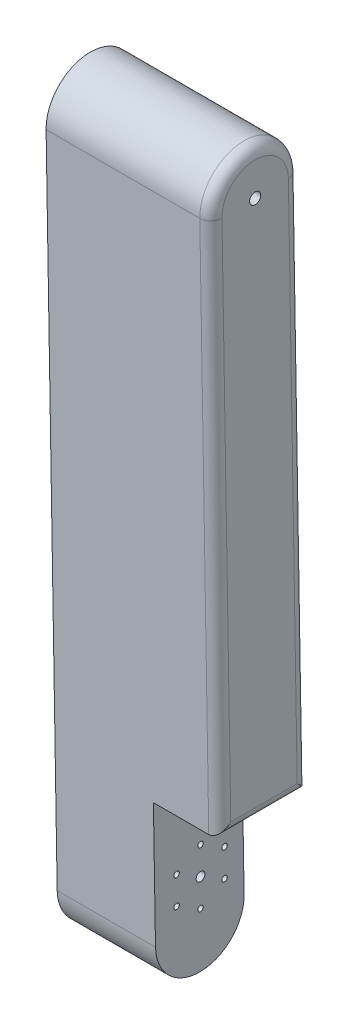
ISO-10303-21;
HEADER;
FILE_DESCRIPTION(('STEP AP214'),'2;1');
FILE_NAME('part.step','',(''),(''),'','','');
FILE_SCHEMA(('AUTOMOTIVE_DESIGN { 1 0 10303 214 1 1 1 1 }'));
ENDSEC;
DATA;
#1=APPLICATION_CONTEXT('core data for automotive mechanical design processes');
#2=APPLICATION_PROTOCOL_DEFINITION('international standard','automotive_design',2000,#1);
#3=PRODUCT_CONTEXT('',#1,'mechanical');
#4=PRODUCT('Part','Part','',(#3));
#5=PRODUCT_RELATED_PRODUCT_CATEGORY('part','',(#4));
#6=PRODUCT_DEFINITION_FORMATION('','',#4);
#7=PRODUCT_DEFINITION_CONTEXT('part definition',#1,'design');
#8=PRODUCT_DEFINITION('design','',#6,#7);
#9=PRODUCT_DEFINITION_SHAPE('','',#8);
#10=(LENGTH_UNIT() NAMED_UNIT(*) SI_UNIT(.MILLI.,.METRE.));
#11=(NAMED_UNIT(*) PLANE_ANGLE_UNIT() SI_UNIT($,.RADIAN.));
#12=(NAMED_UNIT(*) SI_UNIT($,.STERADIAN.) SOLID_ANGLE_UNIT());
#13=UNCERTAINTY_MEASURE_WITH_UNIT(LENGTH_MEASURE(1.E-05),#10,'distance_accuracy_value','');
#14=(GEOMETRIC_REPRESENTATION_CONTEXT(3) GLOBAL_UNCERTAINTY_ASSIGNED_CONTEXT((#13)) GLOBAL_UNIT_ASSIGNED_CONTEXT((#10,
#11,#12)) REPRESENTATION_CONTEXT('',''));
#15=CARTESIAN_POINT('',(0.,0.,0.));
#16=DIRECTION('',(0.,0.,1.));
#17=DIRECTION('',(1.,0.,0.));
#18=AXIS2_PLACEMENT_3D('',#15,#16,#17);
#19=CARTESIAN_POINT('',(74.4,-300.,-5.));
#20=DIRECTION('',(-1.,0.,0.));
#21=DIRECTION('',(0.,0.,1.));
#22=AXIS2_PLACEMENT_3D('',#19,#20,#21);
#23=CYLINDRICAL_SURFACE('',#22,20.);
#24=CARTESIAN_POINT('',(44.4,-300.,-5.));
#25=DIRECTION('',(1.,0.,0.));
#26=DIRECTION('',(0.,0.,-1.));
#27=AXIS2_PLACEMENT_3D('',#24,#25,#26);
#28=CIRCLE('',#27,20.);
#29=CARTESIAN_POINT('',(44.4,-300.33328704668,14.997222800792));
#30=VERTEX_POINT('',#29);
#31=CARTESIAN_POINT('',(44.4,-299.66671295332,-24.997222800792));
#32=VERTEX_POINT('',#31);
#33=EDGE_CURVE('E114',#30,#32,#28,.T.);
#34=ORIENTED_EDGE('',*,*,#33,.F.);
#35=DIRECTION('',(-1.,0.,0.));
#36=VECTOR('',#35,1.);
#37=CARTESIAN_POINT('',(74.4,-300.33328704668,14.997222800792));
#38=LINE('',#37,#36);
#39=CARTESIAN_POINT('',(0.,-300.33328704668,14.997222800792));
#40=VERTEX_POINT('',#39);
#41=EDGE_CURVE('E141',#30,#40,#38,.T.);
#42=ORIENTED_EDGE('',*,*,#41,.T.);
#43=CARTESIAN_POINT('',(0.,-300.,-5.));
#44=DIRECTION('',(1.,0.,0.));
#45=DIRECTION('',(0.,0.,-1.));
#46=AXIS2_PLACEMENT_3D('',#43,#44,#45);
#47=CIRCLE('',#46,20.);
#48=CARTESIAN_POINT('',(0.,-299.66671295332,-24.997222800792));
#49=VERTEX_POINT('',#48);
#50=EDGE_CURVE('E138',#40,#49,#47,.T.);
#51=ORIENTED_EDGE('',*,*,#50,.T.);
#52=DIRECTION('',(-1.,0.,0.));
#53=VECTOR('',#52,1.);
#54=CARTESIAN_POINT('',(74.4,-299.66671295332,-24.997222800792));
#55=LINE('',#54,#53);
#56=EDGE_CURVE('E130',#32,#49,#55,.T.);
#57=ORIENTED_EDGE('',*,*,#56,.F.);
#58=EDGE_LOOP('',(#34,#42,#51,#57));
#59=FACE_BOUND('',#58,.T.);
#60=ADVANCED_FACE('F47',(#59),#23,.T.);
#61=CARTESIAN_POINT('',(74.4,0.,0.));
#62=DIRECTION('',(-1.,0.,0.));
#63=DIRECTION('',(0.,0.,1.));
#64=AXIS2_PLACEMENT_3D('',#61,#62,#63);
#65=CYLINDRICAL_SURFACE('',#64,20.);
#66=DIRECTION('',(-1.,0.,0.));
#67=VECTOR('',#66,1.);
#68=CARTESIAN_POINT('',(74.4,-0.333287046679867,19.997222800792));
#69=LINE('',#68,#67);
#70=CARTESIAN_POINT('',(69.4,-0.333287046679867,19.997222800792));
#71=VERTEX_POINT('',#70);
#72=CARTESIAN_POINT('',(0.,-0.333287046679867,19.997222800792));
#73=VERTEX_POINT('',#72);
#74=EDGE_CURVE('E146',#71,#73,#69,.T.);
#75=ORIENTED_EDGE('',*,*,#74,.F.);
#76=CARTESIAN_POINT('',(69.4,0.,0.));
#77=DIRECTION('',(1.,0.,0.));
#78=DIRECTION('',(0.,0.,-1.));
#79=AXIS2_PLACEMENT_3D('',#76,#77,#78);
#80=CIRCLE('',#79,20.);
#81=CARTESIAN_POINT('',(69.4,0.333287046679867,-19.997222800792));
#82=VERTEX_POINT('',#81);
#83=EDGE_CURVE('E72',#71,#82,#80,.F.);
#84=ORIENTED_EDGE('',*,*,#83,.T.);
#85=DIRECTION('',(-1.,0.,0.));
#86=VECTOR('',#85,1.);
#87=CARTESIAN_POINT('',(74.4,0.333287046679867,-19.997222800792));
#88=LINE('',#87,#86);
#89=CARTESIAN_POINT('',(0.,0.333287046679867,-19.997222800792));
#90=VERTEX_POINT('',#89);
#91=EDGE_CURVE('E142',#82,#90,#88,.T.);
#92=ORIENTED_EDGE('',*,*,#91,.T.);
#93=CARTESIAN_POINT('',(0.,0.,0.));
#94=DIRECTION('',(1.,0.,0.));
#95=DIRECTION('',(0.,0.,-1.));
#96=AXIS2_PLACEMENT_3D('',#93,#94,#95);
#97=CIRCLE('',#96,20.);
#98=EDGE_CURVE('E239',#90,#73,#97,.T.);
#99=ORIENTED_EDGE('',*,*,#98,.T.);
#100=EDGE_LOOP('',(#75,#84,#92,#99));
#101=FACE_BOUND('',#100,.T.);
#102=ADVANCED_FACE('F253',(#101),#65,.T.);
#103=CARTESIAN_POINT('',(74.4,-0.333287046679867,19.997222800792));
#104=DIRECTION('',(0.,0.0166643523339933,-0.9998611400396));
#105=DIRECTION('',(0.,0.9998611400396,0.0166643523339933));
#106=AXIS2_PLACEMENT_3D('',#103,#104,#105);
#107=PLANE('',#106);
#108=DIRECTION('',(1.,0.,0.));
#109=VECTOR('',#108,1.);
#110=CARTESIAN_POINT('',(44.4,-243.317443397269,15.9474868616155));
#111=LINE('',#110,#109);
#112=CARTESIAN_POINT('',(44.4,-243.317443397269,15.9474868616155));
#113=VERTEX_POINT('',#112);
#114=CARTESIAN_POINT('',(69.4,-243.317443397269,15.9474868616155));
#115=VERTEX_POINT('',#114);
#116=EDGE_CURVE('E126',#113,#115,#111,.T.);
#117=ORIENTED_EDGE('',*,*,#116,.T.);
#118=DIRECTION('',(0.,-0.9998611400396,-0.0166643523339933));
#119=VECTOR('',#118,1.);
#120=CARTESIAN_POINT('',(69.4,-0.333287046679867,19.997222800792));
#121=LINE('',#120,#119);
#122=EDGE_CURVE('E167',#115,#71,#121,.F.);
#123=ORIENTED_EDGE('',*,*,#122,.T.);
#124=ORIENTED_EDGE('',*,*,#74,.T.);
#125=DIRECTION('',(0.,-0.9998611400396,-0.0166643523339933));
#126=VECTOR('',#125,1.);
#127=CARTESIAN_POINT('',(0.,-0.333287046679867,19.997222800792));
#128=LINE('',#127,#126);
#129=EDGE_CURVE('E243',#73,#40,#128,.T.);
#130=ORIENTED_EDGE('',*,*,#129,.T.);
#131=ORIENTED_EDGE('',*,*,#41,.F.);
#132=DIRECTION('',(0.,-0.9998611400396,-0.0166643523339933));
#133=VECTOR('',#132,1.);
#134=CARTESIAN_POINT('',(44.4,-0.333287046679867,19.997222800792));
#135=LINE('',#134,#133);
#136=EDGE_CURVE('E121',#113,#30,#135,.T.);
#137=ORIENTED_EDGE('',*,*,#136,.F.);
#138=EDGE_LOOP('',(#117,#123,#124,#130,#131,#137));
#139=FACE_BOUND('',#138,.T.);
#140=ADVANCED_FACE('F255',(#139),#107,.F.);
#141=CARTESIAN_POINT('',(74.4,0.333287046679867,-19.997222800792));
#142=DIRECTION('',(0.,-0.0166643523339933,0.9998611400396));
#143=DIRECTION('',(0.,-0.9998611400396,-0.0166643523339933));
#144=AXIS2_PLACEMENT_3D('',#141,#142,#143);
#145=PLANE('',#144);
#146=ORIENTED_EDGE('',*,*,#91,.F.);
#147=DIRECTION('',(0.,0.9998611400396,0.0166643523339933));
#148=VECTOR('',#147,1.);
#149=CARTESIAN_POINT('',(69.4,-243.317443397269,-24.0580683081911));
#150=LINE('',#149,#148);
#151=CARTESIAN_POINT('',(69.4,-243.317443397269,-24.0580683081911));
#152=VERTEX_POINT('',#151);
#153=EDGE_CURVE('E57',#82,#152,#150,.F.);
#154=ORIENTED_EDGE('',*,*,#153,.T.);
#155=DIRECTION('',(1.,0.,0.));
#156=VECTOR('',#155,1.);
#157=CARTESIAN_POINT('',(44.4,-243.317443397269,-24.0580683081911));
#158=LINE('',#157,#156);
#159=CARTESIAN_POINT('',(44.4,-243.317443397269,-24.0580683081911));
#160=VERTEX_POINT('',#159);
#161=EDGE_CURVE('E132',#160,#152,#158,.T.);
#162=ORIENTED_EDGE('',*,*,#161,.F.);
#163=DIRECTION('',(0.,0.9998611400396,0.0166643523339933));
#164=VECTOR('',#163,1.);
#165=CARTESIAN_POINT('',(44.4,-243.317443397269,-24.0580683081911));
#166=LINE('',#165,#164);
#167=EDGE_CURVE('E118',#32,#160,#166,.T.);
#168=ORIENTED_EDGE('',*,*,#167,.F.);
#169=ORIENTED_EDGE('',*,*,#56,.T.);
#170=DIRECTION('',(0.,0.9998611400396,0.0166643523339933));
#171=VECTOR('',#170,1.);
#172=CARTESIAN_POINT('',(0.,0.333287046679867,-19.997222800792));
#173=LINE('',#172,#171);
#174=EDGE_CURVE('E148',#49,#90,#173,.T.);
#175=ORIENTED_EDGE('',*,*,#174,.T.);
#176=EDGE_LOOP('',(#146,#154,#162,#168,#169,#175));
#177=FACE_BOUND('',#176,.T.);
#178=ADVANCED_FACE('F128',(#177),#145,.F.);
#179=CARTESIAN_POINT('',(74.4,0.,0.));
#180=DIRECTION('',(1.,0.,0.));
#181=DIRECTION('',(0.,0.,-1.));
#182=AXIS2_PLACEMENT_3D('',#179,#180,#181);
#183=PLANE('',#182);
#184=CARTESIAN_POINT('',(74.4,0.,0.));
#185=DIRECTION('',(1.,0.,0.));
#186=DIRECTION('',(0.,0.,-1.));
#187=AXIS2_PLACEMENT_3D('',#184,#185,#186);
#188=CIRCLE('',#187,2.5);
#189=CARTESIAN_POINT('',(74.4,0.,2.5));
#190=VERTEX_POINT('',#189);
#191=EDGE_CURVE('E456',#190,#190,#188,.T.);
#192=ORIENTED_EDGE('',*,*,#191,.F.);
#193=EDGE_LOOP('',(#192));
#194=FACE_BOUND('',#193,.T.);
#195=CARTESIAN_POINT('',(74.4,0.,0.));
#196=DIRECTION('',(1.,0.,0.));
#197=DIRECTION('',(0.,0.,-1.));
#198=AXIS2_PLACEMENT_3D('',#195,#196,#197);
#199=CIRCLE('',#198,15.);
#200=CARTESIAN_POINT('',(74.4,0.2499652850099,-14.997917100594));
#201=VERTEX_POINT('',#200);
#202=CARTESIAN_POINT('',(74.4,-0.2499652850099,14.997917100594));
#203=VERTEX_POINT('',#202);
#204=EDGE_CURVE('E160',#201,#203,#199,.T.);
#205=ORIENTED_EDGE('',*,*,#204,.T.);
#206=DIRECTION('',(0.,-0.9998611400396,-0.0166643523339933));
#207=VECTOR('',#206,1.);
#208=CARTESIAN_POINT('',(74.4,-243.234121635599,10.9481811614175));
#209=LINE('',#208,#207);
#210=CARTESIAN_POINT('',(74.4,-238.317443397269,11.030125798723));
#211=VERTEX_POINT('',#210);
#212=EDGE_CURVE('E163',#203,#211,#209,.T.);
#213=ORIENTED_EDGE('',*,*,#212,.T.);
#214=DIRECTION('',(0.,0.,1.));
#215=VECTOR('',#214,1.);
#216=CARTESIAN_POINT('',(74.4,-238.317443397269,-24.0580683081911));
#217=LINE('',#216,#215);
#218=CARTESIAN_POINT('',(74.4,-238.317443397269,-18.974040578632));
#219=VERTEX_POINT('',#218);
#220=EDGE_CURVE('E154',#211,#219,#217,.F.);
#221=ORIENTED_EDGE('',*,*,#220,.T.);
#222=DIRECTION('',(0.,0.9998611400396,0.0166643523339933));
#223=VECTOR('',#222,1.);
#224=CARTESIAN_POINT('',(74.4,0.2499652850099,-14.997917100594));
#225=LINE('',#224,#223);
#226=EDGE_CURVE('E157',#219,#201,#225,.T.);
#227=ORIENTED_EDGE('',*,*,#226,.T.);
#228=EDGE_LOOP('',(#205,#213,#221,#227));
#229=FACE_BOUND('',#228,.T.);
#230=ADVANCED_FACE('F269',(#194,#229),#183,.T.);
#231=CARTESIAN_POINT('',(0.,0.,0.));
#232=DIRECTION('',(1.,0.,0.));
#233=DIRECTION('',(0.,0.,-1.));
#234=AXIS2_PLACEMENT_3D('',#231,#232,#233);
#235=PLANE('',#234);
#236=CARTESIAN_POINT('',(0.,0.,0.));
#237=DIRECTION('',(-1.,0.,0.));
#238=DIRECTION('',(0.,0.,1.));
#239=AXIS2_PLACEMENT_3D('',#236,#237,#238);
#240=CIRCLE('',#239,2.5);
#241=CARTESIAN_POINT('',(0.,0.,2.5));
#242=VERTEX_POINT('',#241);
#243=EDGE_CURVE('E459',#242,#242,#240,.T.);
#244=ORIENTED_EDGE('',*,*,#243,.F.);
#245=EDGE_LOOP('',(#244));
#246=FACE_BOUND('',#245,.T.);
#247=CARTESIAN_POINT('',(0.,-282.858832161411,-5.33328704608928));
#248=DIRECTION('',(1.,0.,0.));
#249=DIRECTION('',(0.,0.,-1.));
#250=AXIS2_PLACEMENT_3D('',#247,#248,#249);
#251=CIRCLE('',#250,2.);
#252=CARTESIAN_POINT('',(0.,-282.858832161411,-7.33328704608928));
#253=VERTEX_POINT('',#252);
#254=EDGE_CURVE('E194',#253,#253,#251,.T.);
#255=ORIENTED_EDGE('',*,*,#254,.T.);
#256=EDGE_LOOP('',(#255));
#257=FACE_BOUND('',#256,.T.);
#258=CARTESIAN_POINT('',(0.,-270.358832161411,-5.33328704608928));
#259=DIRECTION('',(1.,0.,0.));
#260=DIRECTION('',(0.,0.,-1.));
#261=AXIS2_PLACEMENT_3D('',#258,#259,#260);
#262=CIRCLE('',#261,1.25);
#263=CARTESIAN_POINT('',(0.,-270.358832161411,-6.58328704608928));
#264=VERTEX_POINT('',#263);
#265=EDGE_CURVE('E179',#264,#264,#262,.T.);
#266=ORIENTED_EDGE('',*,*,#265,.T.);
#267=EDGE_LOOP('',(#266));
#268=FACE_BOUND('',#267,.T.);
#269=CARTESIAN_POINT('',(0.,-276.608832161411,-16.1586045933947));
#270=DIRECTION('',(1.,0.,0.));
#271=DIRECTION('',(0.,0.,-1.));
#272=AXIS2_PLACEMENT_3D('',#269,#270,#271);
#273=CIRCLE('',#272,1.24999999999998);
#274=CARTESIAN_POINT('',(0.,-276.608832161411,-17.4086045933947));
#275=VERTEX_POINT('',#274);
#276=EDGE_CURVE('E213',#275,#275,#273,.T.);
#277=ORIENTED_EDGE('',*,*,#276,.T.);
#278=EDGE_LOOP('',(#277));
#279=FACE_BOUND('',#278,.T.);
#280=CARTESIAN_POINT('',(0.,-289.108832161411,-16.1586045933947));
#281=DIRECTION('',(1.,0.,0.));
#282=DIRECTION('',(0.,0.,-1.));
#283=AXIS2_PLACEMENT_3D('',#280,#281,#282);
#284=CIRCLE('',#283,1.24999999999998);
#285=CARTESIAN_POINT('',(0.,-289.108832161411,-17.4086045933947));
#286=VERTEX_POINT('',#285);
#287=EDGE_CURVE('E209',#286,#286,#284,.T.);
#288=ORIENTED_EDGE('',*,*,#287,.T.);
#289=EDGE_LOOP('',(#288));
#290=FACE_BOUND('',#289,.T.);
#291=CARTESIAN_POINT('',(0.,-295.358832161411,-5.33328704608928));
#292=DIRECTION('',(1.,0.,0.));
#293=DIRECTION('',(0.,0.,-1.));
#294=AXIS2_PLACEMENT_3D('',#291,#292,#293);
#295=CIRCLE('',#294,1.25);
#296=CARTESIAN_POINT('',(0.,-295.358832161411,-6.58328704608927));
#297=VERTEX_POINT('',#296);
#298=EDGE_CURVE('E204',#297,#297,#295,.T.);
#299=ORIENTED_EDGE('',*,*,#298,.T.);
#300=EDGE_LOOP('',(#299));
#301=FACE_BOUND('',#300,.T.);
#302=CARTESIAN_POINT('',(0.,-289.108832161411,5.49203050121622));
#303=DIRECTION('',(1.,0.,0.));
#304=DIRECTION('',(0.,0.,-1.));
#305=AXIS2_PLACEMENT_3D('',#302,#303,#304);
#306=CIRCLE('',#305,1.24999999999998);
#307=CARTESIAN_POINT('',(0.,-289.108832161411,4.24203050121623));
#308=VERTEX_POINT('',#307);
#309=EDGE_CURVE('E199',#308,#308,#306,.T.);
#310=ORIENTED_EDGE('',*,*,#309,.T.);
#311=EDGE_LOOP('',(#310));
#312=FACE_BOUND('',#311,.T.);
#313=CARTESIAN_POINT('',(0.,-276.608832161411,5.49203050121624));
#314=DIRECTION('',(1.,0.,0.));
#315=DIRECTION('',(0.,0.,-1.));
#316=AXIS2_PLACEMENT_3D('',#313,#314,#315);
#317=CIRCLE('',#316,1.25000000000003);
#318=CARTESIAN_POINT('',(0.,-276.608832161411,4.24203050121621));
#319=VERTEX_POINT('',#318);
#320=EDGE_CURVE('E193',#319,#319,#317,.T.);
#321=ORIENTED_EDGE('',*,*,#320,.T.);
#322=EDGE_LOOP('',(#321));
#323=FACE_BOUND('',#322,.T.);
#324=ORIENTED_EDGE('',*,*,#98,.F.);
#325=ORIENTED_EDGE('',*,*,#174,.F.);
#326=ORIENTED_EDGE('',*,*,#50,.F.);
#327=ORIENTED_EDGE('',*,*,#129,.F.);
#328=EDGE_LOOP('',(#324,#325,#326,#327));
#329=FACE_BOUND('',#328,.T.);
#330=ADVANCED_FACE('F252',(#246,#257,#268,#279,#290,#301,#312,#323,#329),#235,.F.);
#331=CARTESIAN_POINT('',(44.4,-300.007916719122,-4.52499685265799));
#332=DIRECTION('',(1.,0.,0.));
#333=DIRECTION('',(0.,0.,-1.));
#334=AXIS2_PLACEMENT_3D('',#331,#332,#333);
#335=PLANE('',#334);
#336=CARTESIAN_POINT('',(44.4,-282.858832161411,-5.33328704608928));
#337=DIRECTION('',(1.,0.,0.));
#338=DIRECTION('',(0.,0.,-1.));
#339=AXIS2_PLACEMENT_3D('',#336,#337,#338);
#340=CIRCLE('',#339,2.);
#341=CARTESIAN_POINT('',(44.4,-282.858832161411,-7.33328704608928));
#342=VERTEX_POINT('',#341);
#343=EDGE_CURVE('E51',#342,#342,#340,.T.);
#344=ORIENTED_EDGE('',*,*,#343,.F.);
#345=EDGE_LOOP('',(#344));
#346=FACE_BOUND('',#345,.T.);
#347=CARTESIAN_POINT('',(44.4,-270.358832161411,-5.33328704608928));
#348=DIRECTION('',(1.,0.,0.));
#349=DIRECTION('',(0.,0.,-1.));
#350=AXIS2_PLACEMENT_3D('',#347,#348,#349);
#351=CIRCLE('',#350,1.25);
#352=CARTESIAN_POINT('',(44.4,-270.358832161411,-6.58328704608928));
#353=VERTEX_POINT('',#352);
#354=EDGE_CURVE('E214',#353,#353,#351,.T.);
#355=ORIENTED_EDGE('',*,*,#354,.F.);
#356=EDGE_LOOP('',(#355));
#357=FACE_BOUND('',#356,.T.);
#358=CARTESIAN_POINT('',(44.4,-276.608832161411,-16.1586045933947));
#359=DIRECTION('',(1.,0.,0.));
#360=DIRECTION('',(0.,0.,-1.));
#361=AXIS2_PLACEMENT_3D('',#358,#359,#360);
#362=CIRCLE('',#361,1.24999999999998);
#363=CARTESIAN_POINT('',(44.4,-276.608832161411,-17.4086045933947));
#364=VERTEX_POINT('',#363);
#365=EDGE_CURVE('E210',#364,#364,#362,.T.);
#366=ORIENTED_EDGE('',*,*,#365,.F.);
#367=EDGE_LOOP('',(#366));
#368=FACE_BOUND('',#367,.T.);
#369=CARTESIAN_POINT('',(44.4,-289.108832161411,-16.1586045933947));
#370=DIRECTION('',(1.,0.,0.));
#371=DIRECTION('',(0.,0.,-1.));
#372=AXIS2_PLACEMENT_3D('',#369,#370,#371);
#373=CIRCLE('',#372,1.24999999999998);
#374=CARTESIAN_POINT('',(44.4,-289.108832161411,-17.4086045933947));
#375=VERTEX_POINT('',#374);
#376=EDGE_CURVE('E205',#375,#375,#373,.T.);
#377=ORIENTED_EDGE('',*,*,#376,.F.);
#378=EDGE_LOOP('',(#377));
#379=FACE_BOUND('',#378,.T.);
#380=CARTESIAN_POINT('',(44.4,-295.358832161411,-5.33328704608928));
#381=DIRECTION('',(1.,0.,0.));
#382=DIRECTION('',(0.,0.,-1.));
#383=AXIS2_PLACEMENT_3D('',#380,#381,#382);
#384=CIRCLE('',#383,1.25);
#385=CARTESIAN_POINT('',(44.4,-295.358832161411,-6.58328704608927));
#386=VERTEX_POINT('',#385);
#387=EDGE_CURVE('E200',#386,#386,#384,.T.);
#388=ORIENTED_EDGE('',*,*,#387,.F.);
#389=EDGE_LOOP('',(#388));
#390=FACE_BOUND('',#389,.T.);
#391=CARTESIAN_POINT('',(44.4,-289.108832161411,5.49203050121622));
#392=DIRECTION('',(1.,0.,0.));
#393=DIRECTION('',(0.,0.,-1.));
#394=AXIS2_PLACEMENT_3D('',#391,#392,#393);
#395=CIRCLE('',#394,1.24999999999998);
#396=CARTESIAN_POINT('',(44.4,-289.108832161411,4.24203050121623));
#397=VERTEX_POINT('',#396);
#398=EDGE_CURVE('E195',#397,#397,#395,.T.);
#399=ORIENTED_EDGE('',*,*,#398,.F.);
#400=EDGE_LOOP('',(#399));
#401=FACE_BOUND('',#400,.T.);
#402=CARTESIAN_POINT('',(44.4,-276.608832161411,5.49203050121624));
#403=DIRECTION('',(1.,0.,0.));
#404=DIRECTION('',(0.,0.,-1.));
#405=AXIS2_PLACEMENT_3D('',#402,#403,#404);
#406=CIRCLE('',#405,1.25000000000003);
#407=CARTESIAN_POINT('',(44.4,-276.608832161411,4.24203050121621));
#408=VERTEX_POINT('',#407);
#409=EDGE_CURVE('E189',#408,#408,#406,.T.);
#410=ORIENTED_EDGE('',*,*,#409,.F.);
#411=EDGE_LOOP('',(#410));
#412=FACE_BOUND('',#411,.T.);
#413=ORIENTED_EDGE('',*,*,#136,.T.);
#414=ORIENTED_EDGE('',*,*,#33,.T.);
#415=ORIENTED_EDGE('',*,*,#167,.T.);
#416=DIRECTION('',(0.,0.,1.));
#417=VECTOR('',#416,1.);
#418=CARTESIAN_POINT('',(44.4,-243.317443397269,15.9474868616155));
#419=LINE('',#418,#417);
#420=EDGE_CURVE('E134',#160,#113,#419,.T.);
#421=ORIENTED_EDGE('',*,*,#420,.T.);
#422=EDGE_LOOP('',(#413,#414,#415,#421));
#423=FACE_BOUND('',#422,.T.);
#424=ADVANCED_FACE('F116',(#346,#357,#368,#379,#390,#401,#412,#423),#335,.T.);
#425=CARTESIAN_POINT('',(44.4,-243.317443397269,15.9474868616155));
#426=DIRECTION('',(0.,1.,0.));
#427=DIRECTION('',(0.,0.,1.));
#428=AXIS2_PLACEMENT_3D('',#425,#426,#427);
#429=PLANE('',#428);
#430=ORIENTED_EDGE('',*,*,#161,.T.);
#431=DIRECTION('',(0.,0.,1.));
#432=VECTOR('',#431,1.);
#433=CARTESIAN_POINT('',(69.4,-243.317443397269,15.9474868616155));
#434=LINE('',#433,#432);
#435=EDGE_CURVE('E11',#152,#115,#434,.T.);
#436=ORIENTED_EDGE('',*,*,#435,.T.);
#437=ORIENTED_EDGE('',*,*,#116,.F.);
#438=ORIENTED_EDGE('',*,*,#420,.F.);
#439=EDGE_LOOP('',(#430,#436,#437,#438));
#440=FACE_BOUND('',#439,.T.);
#441=ADVANCED_FACE('F276',(#440),#429,.F.);
#442=CARTESIAN_POINT('',(69.4,0.2499652850099,-14.997917100594));
#443=DIRECTION('',(0.,-0.9998611400396,-0.0166643523339933));
#444=DIRECTION('',(0.,0.0166643523339933,-0.9998611400396));
#445=AXIS2_PLACEMENT_3D('',#442,#443,#444);
#446=CYLINDRICAL_SURFACE('',#445,5.);
#447=CARTESIAN_POINT('',(69.4,-238.317443397269,-18.974040578632));
#448=DIRECTION('',(0.,0.712974176367557,-0.701190290743535));
#449=DIRECTION('',(0.,-0.701190290743535,-0.712974176367557));
#450=AXIS2_PLACEMENT_3D('',#447,#448,#449);
#451=ELLIPSE('',#450,7.13073193682995,5.);
#452=EDGE_CURVE('E182',#152,#219,#451,.F.);
#453=ORIENTED_EDGE('',*,*,#452,.F.);
#454=ORIENTED_EDGE('',*,*,#153,.F.);
#455=CARTESIAN_POINT('',(69.4,0.2499652850099,-14.997917100594));
#456=DIRECTION('',(0.,0.9998611400396,0.0166643523339933));
#457=DIRECTION('',(0.,-0.0166643523339933,0.9998611400396));
#458=AXIS2_PLACEMENT_3D('',#455,#456,#457);
#459=CIRCLE('',#458,5.);
#460=EDGE_CURVE('E135',#201,#82,#459,.T.);
#461=ORIENTED_EDGE('',*,*,#460,.F.);
#462=ORIENTED_EDGE('',*,*,#226,.F.);
#463=EDGE_LOOP('',(#453,#454,#461,#462));
#464=FACE_BOUND('',#463,.T.);
#465=ADVANCED_FACE('F49',(#464),#446,.T.);
#466=CARTESIAN_POINT('',(69.4,0.,0.));
#467=DIRECTION('',(1.,0.,0.));
#468=DIRECTION('',(0.,0.,-1.));
#469=AXIS2_PLACEMENT_3D('',#466,#467,#468);
#470=TOROIDAL_SURFACE('',#469,15.,5.);
#471=ORIENTED_EDGE('',*,*,#460,.T.);
#472=ORIENTED_EDGE('',*,*,#83,.F.);
#473=CARTESIAN_POINT('',(69.4,-0.2499652850099,14.997917100594));
#474=DIRECTION('',(0.,-0.9998611400396,-0.0166643523339933));
#475=DIRECTION('',(0.,0.0166643523339933,-0.9998611400396));
#476=AXIS2_PLACEMENT_3D('',#473,#474,#475);
#477=CIRCLE('',#476,5.);
#478=EDGE_CURVE('E178',#203,#71,#477,.T.);
#479=ORIENTED_EDGE('',*,*,#478,.F.);
#480=ORIENTED_EDGE('',*,*,#204,.F.);
#481=EDGE_LOOP('',(#471,#472,#479,#480));
#482=FACE_BOUND('',#481,.T.);
#483=ADVANCED_FACE('F273',(#482),#470,.T.);
#484=CARTESIAN_POINT('',(69.4,-238.317443397269,15.9474868616155));
#485=DIRECTION('',(0.,0.,-1.));
#486=DIRECTION('',(-1.,0.,0.));
#487=AXIS2_PLACEMENT_3D('',#484,#485,#486);
#488=CYLINDRICAL_SURFACE('',#487,5.);
#489=ORIENTED_EDGE('',*,*,#452,.T.);
#490=ORIENTED_EDGE('',*,*,#220,.F.);
#491=CARTESIAN_POINT('',(69.4,-238.317443397269,11.030125798723));
#492=DIRECTION('',(0.,-0.701190290743535,-0.712974176367557));
#493=DIRECTION('',(0.,0.712974176367557,-0.701190290743535));
#494=AXIS2_PLACEMENT_3D('',#491,#492,#493);
#495=ELLIPSE('',#494,7.01287671521832,5.);
#496=EDGE_CURVE('E175',#115,#211,#495,.F.);
#497=ORIENTED_EDGE('',*,*,#496,.F.);
#498=ORIENTED_EDGE('',*,*,#435,.F.);
#499=EDGE_LOOP('',(#489,#490,#497,#498));
#500=FACE_BOUND('',#499,.T.);
#501=ADVANCED_FACE('F265',(#500),#488,.T.);
#502=CARTESIAN_POINT('',(69.4,-0.2499652850099,14.997917100594));
#503=DIRECTION('',(0.,0.9998611400396,0.0166643523339933));
#504=DIRECTION('',(0.,-0.0166643523339933,0.9998611400396));
#505=AXIS2_PLACEMENT_3D('',#502,#503,#504);
#506=CYLINDRICAL_SURFACE('',#505,5.);
#507=ORIENTED_EDGE('',*,*,#478,.T.);
#508=ORIENTED_EDGE('',*,*,#122,.F.);
#509=ORIENTED_EDGE('',*,*,#496,.T.);
#510=ORIENTED_EDGE('',*,*,#212,.F.);
#511=EDGE_LOOP('',(#507,#508,#509,#510));
#512=FACE_BOUND('',#511,.T.);
#513=ADVANCED_FACE('F259',(#512),#506,.T.);
#514=CARTESIAN_POINT('',(74.4,-276.608832161411,5.49203050121624));
#515=DIRECTION('',(-1.,0.,0.));
#516=DIRECTION('',(0.,0.,1.));
#517=AXIS2_PLACEMENT_3D('',#514,#515,#516);
#518=CYLINDRICAL_SURFACE('',#517,1.25000000000003);
#519=ORIENTED_EDGE('',*,*,#409,.T.);
#520=EDGE_LOOP('',(#519));
#521=FACE_BOUND('',#520,.T.);
#522=ORIENTED_EDGE('',*,*,#320,.F.);
#523=EDGE_LOOP('',(#522));
#524=FACE_BOUND('',#523,.T.);
#525=ADVANCED_FACE('F296',(#521,#524),#518,.F.);
#526=CARTESIAN_POINT('',(74.4,-289.108832161411,5.49203050121622));
#527=DIRECTION('',(-1.,0.,0.));
#528=DIRECTION('',(0.,0.,1.));
#529=AXIS2_PLACEMENT_3D('',#526,#527,#528);
#530=CYLINDRICAL_SURFACE('',#529,1.24999999999998);
#531=ORIENTED_EDGE('',*,*,#398,.T.);
#532=EDGE_LOOP('',(#531));
#533=FACE_BOUND('',#532,.T.);
#534=ORIENTED_EDGE('',*,*,#309,.F.);
#535=EDGE_LOOP('',(#534));
#536=FACE_BOUND('',#535,.T.);
#537=ADVANCED_FACE('F314',(#533,#536),#530,.F.);
#538=CARTESIAN_POINT('',(74.4,-295.358832161411,-5.33328704608928));
#539=DIRECTION('',(-1.,0.,0.));
#540=DIRECTION('',(0.,0.,1.));
#541=AXIS2_PLACEMENT_3D('',#538,#539,#540);
#542=CYLINDRICAL_SURFACE('',#541,1.25);
#543=ORIENTED_EDGE('',*,*,#387,.T.);
#544=EDGE_LOOP('',(#543));
#545=FACE_BOUND('',#544,.T.);
#546=ORIENTED_EDGE('',*,*,#298,.F.);
#547=EDGE_LOOP('',(#546));
#548=FACE_BOUND('',#547,.T.);
#549=ADVANCED_FACE('F323',(#545,#548),#542,.F.);
#550=CARTESIAN_POINT('',(74.4,-289.108832161411,-16.1586045933947));
#551=DIRECTION('',(-1.,0.,0.));
#552=DIRECTION('',(0.,0.,1.));
#553=AXIS2_PLACEMENT_3D('',#550,#551,#552);
#554=CYLINDRICAL_SURFACE('',#553,1.24999999999998);
#555=ORIENTED_EDGE('',*,*,#376,.T.);
#556=EDGE_LOOP('',(#555));
#557=FACE_BOUND('',#556,.T.);
#558=ORIENTED_EDGE('',*,*,#287,.F.);
#559=EDGE_LOOP('',(#558));
#560=FACE_BOUND('',#559,.T.);
#561=ADVANCED_FACE('F332',(#557,#560),#554,.F.);
#562=CARTESIAN_POINT('',(74.4,-276.608832161411,-16.1586045933947));
#563=DIRECTION('',(-1.,0.,0.));
#564=DIRECTION('',(0.,0.,1.));
#565=AXIS2_PLACEMENT_3D('',#562,#563,#564);
#566=CYLINDRICAL_SURFACE('',#565,1.24999999999998);
#567=ORIENTED_EDGE('',*,*,#365,.T.);
#568=EDGE_LOOP('',(#567));
#569=FACE_BOUND('',#568,.T.);
#570=ORIENTED_EDGE('',*,*,#276,.F.);
#571=EDGE_LOOP('',(#570));
#572=FACE_BOUND('',#571,.T.);
#573=ADVANCED_FACE('F341',(#569,#572),#566,.F.);
#574=CARTESIAN_POINT('',(74.4,-270.358832161411,-5.33328704608928));
#575=DIRECTION('',(-1.,0.,0.));
#576=DIRECTION('',(0.,0.,1.));
#577=AXIS2_PLACEMENT_3D('',#574,#575,#576);
#578=CYLINDRICAL_SURFACE('',#577,1.25);
#579=ORIENTED_EDGE('',*,*,#354,.T.);
#580=EDGE_LOOP('',(#579));
#581=FACE_BOUND('',#580,.T.);
#582=ORIENTED_EDGE('',*,*,#265,.F.);
#583=EDGE_LOOP('',(#582));
#584=FACE_BOUND('',#583,.T.);
#585=ADVANCED_FACE('F350',(#581,#584),#578,.F.);
#586=CARTESIAN_POINT('',(74.4,-282.858832161411,-5.33328704608928));
#587=DIRECTION('',(-1.,0.,0.));
#588=DIRECTION('',(0.,0.,1.));
#589=AXIS2_PLACEMENT_3D('',#586,#587,#588);
#590=CYLINDRICAL_SURFACE('',#589,2.);
#591=ORIENTED_EDGE('',*,*,#343,.T.);
#592=EDGE_LOOP('',(#591));
#593=FACE_BOUND('',#592,.T.);
#594=ORIENTED_EDGE('',*,*,#254,.F.);
#595=EDGE_LOOP('',(#594));
#596=FACE_BOUND('',#595,.T.);
#597=ADVANCED_FACE('F359',(#593,#596),#590,.F.);
#598=CARTESIAN_POINT('',(100.,0.,0.));
#599=DIRECTION('',(-1.,0.,0.));
#600=DIRECTION('',(0.,0.,1.));
#601=AXIS2_PLACEMENT_3D('',#598,#599,#600);
#602=CYLINDRICAL_SURFACE('',#601,2.5);
#603=CARTESIAN_POINT('',(74.4,0.,2.5));
#604=CARTESIAN_POINT('',(73.625,0.,2.5));
#605=CARTESIAN_POINT('',(72.85,0.,2.5));
#606=CARTESIAN_POINT('',(71.3,0.,2.5));
#607=CARTESIAN_POINT('',(70.525,0.,2.5));
#608=CARTESIAN_POINT('',(68.975,0.,2.5));
#609=CARTESIAN_POINT('',(68.2,0.,2.5));
#610=CARTESIAN_POINT('',(66.65,0.,2.5));
#611=CARTESIAN_POINT('',(65.875,0.,2.5));
#612=CARTESIAN_POINT('',(64.325,0.,2.5));
#613=CARTESIAN_POINT('',(63.55,0.,2.5));
#614=CARTESIAN_POINT('',(62.,0.,2.5));
#615=CARTESIAN_POINT('',(61.225,0.,2.5));
#616=CARTESIAN_POINT('',(59.675,0.,2.5));
#617=CARTESIAN_POINT('',(58.9,0.,2.5));
#618=CARTESIAN_POINT('',(57.35,0.,2.5));
#619=CARTESIAN_POINT('',(56.575,0.,2.5));
#620=CARTESIAN_POINT('',(55.025,0.,2.5));
#621=CARTESIAN_POINT('',(54.25,0.,2.5));
#622=CARTESIAN_POINT('',(52.7,0.,2.5));
#623=CARTESIAN_POINT('',(51.925,0.,2.5));
#624=CARTESIAN_POINT('',(50.375,0.,2.5));
#625=CARTESIAN_POINT('',(49.6,0.,2.5));
#626=CARTESIAN_POINT('',(48.05,0.,2.5));
#627=CARTESIAN_POINT('',(47.275,0.,2.5));
#628=CARTESIAN_POINT('',(45.725,0.,2.5));
#629=CARTESIAN_POINT('',(44.95,0.,2.5));
#630=CARTESIAN_POINT('',(43.4,0.,2.5));
#631=CARTESIAN_POINT('',(42.625,0.,2.5));
#632=CARTESIAN_POINT('',(41.075,0.,2.5));
#633=CARTESIAN_POINT('',(40.3,0.,2.5));
#634=CARTESIAN_POINT('',(38.75,0.,2.5));
#635=CARTESIAN_POINT('',(37.975,0.,2.5));
#636=CARTESIAN_POINT('',(36.425,0.,2.5));
#637=CARTESIAN_POINT('',(35.65,0.,2.5));
#638=CARTESIAN_POINT('',(34.1,0.,2.5));
#639=CARTESIAN_POINT('',(33.325,0.,2.5));
#640=CARTESIAN_POINT('',(31.775,0.,2.5));
#641=CARTESIAN_POINT('',(31.,0.,2.5));
#642=CARTESIAN_POINT('',(29.45,0.,2.5));
#643=CARTESIAN_POINT('',(28.675,0.,2.5));
#644=CARTESIAN_POINT('',(27.125,0.,2.5));
#645=CARTESIAN_POINT('',(26.35,0.,2.5));
#646=CARTESIAN_POINT('',(24.8,0.,2.5));
#647=CARTESIAN_POINT('',(24.025,0.,2.5));
#648=CARTESIAN_POINT('',(22.475,0.,2.5));
#649=CARTESIAN_POINT('',(21.7,0.,2.5));
#650=CARTESIAN_POINT('',(20.15,0.,2.5));
#651=CARTESIAN_POINT('',(19.375,0.,2.5));
#652=CARTESIAN_POINT('',(17.825,0.,2.5));
#653=CARTESIAN_POINT('',(17.05,0.,2.5));
#654=CARTESIAN_POINT('',(15.5,0.,2.5));
#655=CARTESIAN_POINT('',(14.725,0.,2.5));
#656=CARTESIAN_POINT('',(13.175,0.,2.5));
#657=CARTESIAN_POINT('',(12.4,0.,2.5));
#658=CARTESIAN_POINT('',(10.85,0.,2.5));
#659=CARTESIAN_POINT('',(10.075,0.,2.5));
#660=CARTESIAN_POINT('',(8.52500000000001,0.,2.5));
#661=CARTESIAN_POINT('',(7.75000000000001,0.,2.5));
#662=CARTESIAN_POINT('',(6.2,0.,2.5));
#663=CARTESIAN_POINT('',(5.42499999999999,0.,2.5));
#664=CARTESIAN_POINT('',(3.87499999999999,0.,2.5));
#665=CARTESIAN_POINT('',(3.09999999999999,0.,2.5));
#666=CARTESIAN_POINT('',(1.55,0.,2.5));
#667=CARTESIAN_POINT('',(0.774999999999998,0.,2.5));
#668=CARTESIAN_POINT('',(0.,0.,2.5));
#669=B_SPLINE_CURVE_WITH_KNOTS('',3,(#603,#604,#605,#606,#607,#608,#609,#610,#611,#612,#613,
#614,#615,#616,#617,#618,#619,#620,#621,#622,#623,#624,#625,#626,#627,#628,#629,#630,#631,#632,
#633,#634,#635,#636,#637,#638,#639,#640,#641,#642,#643,#644,#645,#646,#647,#648,#649,#650,#651,
#652,#653,#654,#655,#656,#657,#658,#659,#660,#661,#662,#663,#664,#665,#666,#667,#668),
.UNSPECIFIED.,.F.,.F.,(4,2,2,2,2,2,2,2,2,2,2,2,2,2,2,2,2,2,2,2,2,2,2,2,2,2,2,2,2,2,2,2,4),(0.,
2.32500000000001,4.65,6.975,9.3,11.625,13.95,16.275,18.6,20.925,23.25,25.575,27.9,30.225,32.55,
34.875,37.2,39.525,41.85,44.175,46.5,48.825,51.15,53.475,55.8,58.125,60.45,62.775,65.1,67.425,
69.75,72.075,74.4),.UNSPECIFIED.);
#670=EDGE_CURVE('BSEAM377',#190,#242,#669,.T.);
#671=ORIENTED_EDGE('',*,*,#191,.T.);
#672=ORIENTED_EDGE('',*,*,#243,.T.);
#673=ORIENTED_EDGE('',*,*,#670,.T.);
#674=ORIENTED_EDGE('',*,*,#670,.F.);
#675=EDGE_LOOP('',(#671,#673,#672,#674));
#676=FACE_BOUND('',#675,.T.);
#677=ADVANCED_FACE('F377',(#676),#602,.F.);
#678=CLOSED_SHELL('',(#60,#102,#140,#178,#230,#330,#424,#441,#465,#483,#501,#513,#525,#537,#549,
#561,#573,#585,#597,#677));
#679=MANIFOLD_SOLID_BREP('B2',#678);
#680=ADVANCED_BREP_SHAPE_REPRESENTATION('',(#18,#679),#14);
#681=SHAPE_DEFINITION_REPRESENTATION(#9,#680);
ENDSEC;
END-ISO-10303-21;
